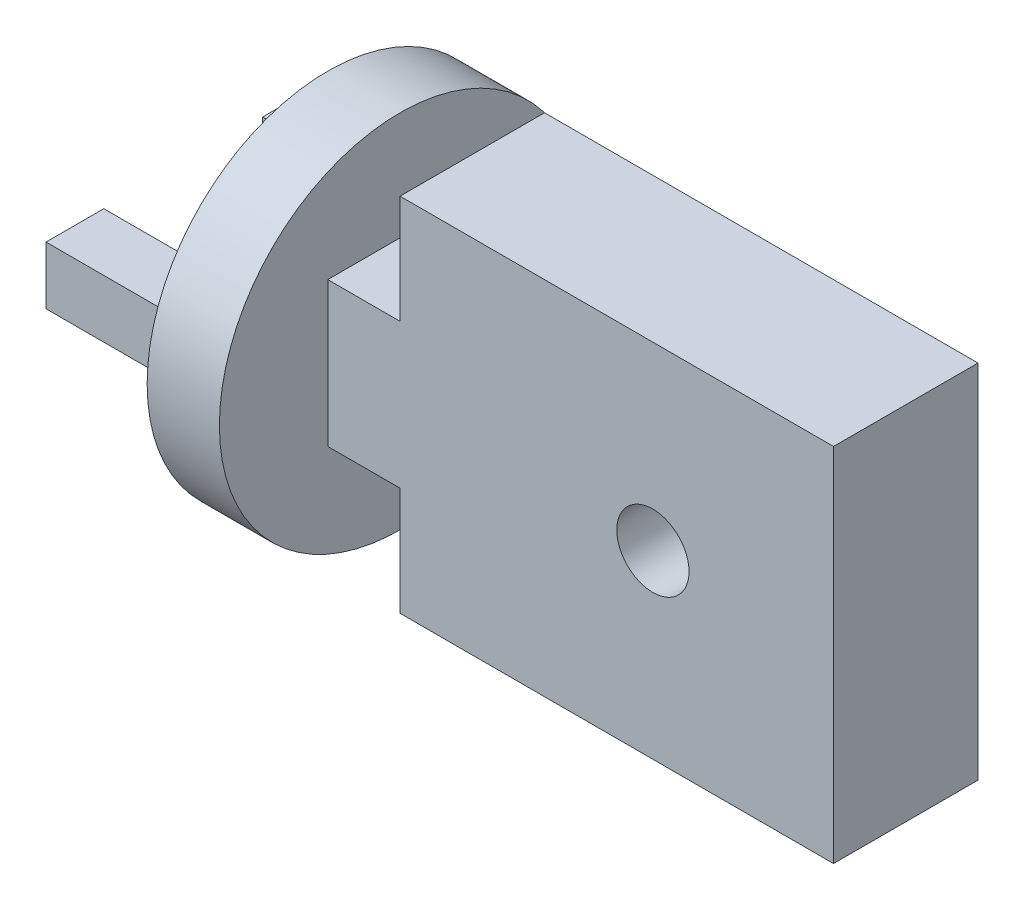
ISO-10303-21;
HEADER;
FILE_DESCRIPTION(('STEP AP214'),'2;1');
FILE_NAME('part.step','',(''),(''),'','','');
FILE_SCHEMA(('AUTOMOTIVE_DESIGN { 1 0 10303 214 1 1 1 1 }'));
ENDSEC;
DATA;
#1=APPLICATION_CONTEXT('core data for automotive mechanical design processes');
#2=APPLICATION_PROTOCOL_DEFINITION('international standard','automotive_design',2000,#1);
#3=PRODUCT_CONTEXT('',#1,'mechanical');
#4=PRODUCT('Part','Part','',(#3));
#5=PRODUCT_RELATED_PRODUCT_CATEGORY('part','',(#4));
#6=PRODUCT_DEFINITION_FORMATION('','',#4);
#7=PRODUCT_DEFINITION_CONTEXT('part definition',#1,'design');
#8=PRODUCT_DEFINITION('design','',#6,#7);
#9=PRODUCT_DEFINITION_SHAPE('','',#8);
#10=(LENGTH_UNIT() NAMED_UNIT(*) SI_UNIT(.MILLI.,.METRE.));
#11=(NAMED_UNIT(*) PLANE_ANGLE_UNIT() SI_UNIT($,.RADIAN.));
#12=(NAMED_UNIT(*) SI_UNIT($,.STERADIAN.) SOLID_ANGLE_UNIT());
#13=UNCERTAINTY_MEASURE_WITH_UNIT(LENGTH_MEASURE(1.E-05),#10,'distance_accuracy_value','');
#14=(GEOMETRIC_REPRESENTATION_CONTEXT(3) GLOBAL_UNCERTAINTY_ASSIGNED_CONTEXT((#13)) GLOBAL_UNIT_ASSIGNED_CONTEXT((#10,
#11,#12)) REPRESENTATION_CONTEXT('',''));
#15=CARTESIAN_POINT('',(0.,0.,0.));
#16=DIRECTION('',(0.,0.,1.));
#17=DIRECTION('',(1.,0.,0.));
#18=AXIS2_PLACEMENT_3D('',#15,#16,#17);
#19=CARTESIAN_POINT('',(-76.2,63.5,127.));
#20=DIRECTION('',(1.,0.,0.));
#21=DIRECTION('',(0.,1.,0.));
#22=AXIS2_PLACEMENT_3D('',#19,#20,#21);
#23=PLANE('',#22);
#24=DIRECTION('',(0.,0.,-1.));
#25=VECTOR('',#24,1.);
#26=CARTESIAN_POINT('',(-76.2,-63.5,127.));
#27=LINE('',#26,#25);
#28=CARTESIAN_POINT('',(-76.2,-63.5,88.9));
#29=VERTEX_POINT('',#28);
#30=CARTESIAN_POINT('',(-76.2,-63.5,38.1));
#31=VERTEX_POINT('',#30);
#32=EDGE_CURVE('E181',#29,#31,#27,.T.);
#33=ORIENTED_EDGE('',*,*,#32,.F.);
#34=DIRECTION('',(0.,1.,0.));
#35=VECTOR('',#34,1.);
#36=CARTESIAN_POINT('',(-76.2,-63.5,88.9));
#37=LINE('',#36,#35);
#38=CARTESIAN_POINT('',(-76.2,-25.4,88.9));
#39=VERTEX_POINT('',#38);
#40=EDGE_CURVE('E161',#29,#39,#37,.T.);
#41=ORIENTED_EDGE('',*,*,#40,.T.);
#42=DIRECTION('',(0.,0.,1.));
#43=VECTOR('',#42,1.);
#44=CARTESIAN_POINT('',(-76.2,-25.4,38.1));
#45=LINE('',#44,#43);
#46=CARTESIAN_POINT('',(-76.2,-25.4,38.1));
#47=VERTEX_POINT('',#46);
#48=EDGE_CURVE('E312',#47,#39,#45,.T.);
#49=ORIENTED_EDGE('',*,*,#48,.F.);
#50=DIRECTION('',(0.,1.,0.));
#51=VECTOR('',#50,1.);
#52=CARTESIAN_POINT('',(-76.2,-63.5,38.1));
#53=LINE('',#52,#51);
#54=EDGE_CURVE('E217',#31,#47,#53,.T.);
#55=ORIENTED_EDGE('',*,*,#54,.F.);
#56=EDGE_LOOP('',(#33,#41,#49,#55));
#57=FACE_BOUND('',#56,.T.);
#58=ADVANCED_FACE('F39',(#57),#23,.F.);
#59=CARTESIAN_POINT('',(-127.,0.,63.5));
#60=DIRECTION('',(-1.,0.,0.));
#61=DIRECTION('',(0.,0.,1.));
#62=AXIS2_PLACEMENT_3D('',#59,#60,#61);
#63=PLANE('',#62);
#64=CARTESIAN_POINT('',(-127.,0.,63.5));
#65=DIRECTION('',(-1.,0.,0.));
#66=DIRECTION('',(0.,0.,1.));
#67=AXIS2_PLACEMENT_3D('',#64,#65,#66);
#68=CIRCLE('',#67,63.5);
#69=CARTESIAN_POINT('',(-127.,0.,127.));
#70=VERTEX_POINT('',#69);
#71=EDGE_CURVE('E299',#70,#70,#68,.T.);
#72=ORIENTED_EDGE('',*,*,#71,.T.);
#73=EDGE_LOOP('',(#72));
#74=FACE_BOUND('',#73,.T.);
#75=DIRECTION('',(0.,0.,-1.));
#76=VECTOR('',#75,1.);
#77=CARTESIAN_POINT('',(-127.,10.16,15.24));
#78=LINE('',#77,#76);
#79=CARTESIAN_POINT('',(-127.,10.16,35.56));
#80=VERTEX_POINT('',#79);
#81=CARTESIAN_POINT('',(-127.,10.16,15.24));
#82=VERTEX_POINT('',#81);
#83=EDGE_CURVE('E278',#80,#82,#78,.T.);
#84=ORIENTED_EDGE('',*,*,#83,.F.);
#85=DIRECTION('',(0.,1.,0.));
#86=VECTOR('',#85,1.);
#87=CARTESIAN_POINT('',(-127.,10.16,35.56));
#88=LINE('',#87,#86);
#89=CARTESIAN_POINT('',(-127.,-10.16,35.56));
#90=VERTEX_POINT('',#89);
#91=EDGE_CURVE('E259',#90,#80,#88,.T.);
#92=ORIENTED_EDGE('',*,*,#91,.F.);
#93=DIRECTION('',(0.,0.,1.));
#94=VECTOR('',#93,1.);
#95=CARTESIAN_POINT('',(-127.,-10.16,15.24));
#96=LINE('',#95,#94);
#97=CARTESIAN_POINT('',(-127.,-10.16,15.24));
#98=VERTEX_POINT('',#97);
#99=EDGE_CURVE('E265',#98,#90,#96,.T.);
#100=ORIENTED_EDGE('',*,*,#99,.F.);
#101=DIRECTION('',(0.,-1.,0.));
#102=VECTOR('',#101,1.);
#103=CARTESIAN_POINT('',(-127.,10.16,15.24));
#104=LINE('',#103,#102);
#105=EDGE_CURVE('E281',#82,#98,#104,.T.);
#106=ORIENTED_EDGE('',*,*,#105,.F.);
#107=EDGE_LOOP('',(#84,#92,#100,#106));
#108=FACE_BOUND('',#107,.T.);
#109=DIRECTION('',(0.,0.,-1.));
#110=VECTOR('',#109,1.);
#111=CARTESIAN_POINT('',(-127.,10.16,91.44));
#112=LINE('',#111,#110);
#113=CARTESIAN_POINT('',(-127.,10.16,111.76));
#114=VERTEX_POINT('',#113);
#115=CARTESIAN_POINT('',(-127.,10.16,91.44));
#116=VERTEX_POINT('',#115);
#117=EDGE_CURVE('E239',#114,#116,#112,.T.);
#118=ORIENTED_EDGE('',*,*,#117,.F.);
#119=DIRECTION('',(0.,1.,0.));
#120=VECTOR('',#119,1.);
#121=CARTESIAN_POINT('',(-127.,10.16,111.76));
#122=LINE('',#121,#120);
#123=CARTESIAN_POINT('',(-127.,-10.16,111.76));
#124=VERTEX_POINT('',#123);
#125=EDGE_CURVE('E235',#124,#114,#122,.T.);
#126=ORIENTED_EDGE('',*,*,#125,.F.);
#127=DIRECTION('',(0.,0.,1.));
#128=VECTOR('',#127,1.);
#129=CARTESIAN_POINT('',(-127.,-10.16,91.44));
#130=LINE('',#129,#128);
#131=CARTESIAN_POINT('',(-127.,-10.16,91.44));
#132=VERTEX_POINT('',#131);
#133=EDGE_CURVE('E225',#132,#124,#130,.T.);
#134=ORIENTED_EDGE('',*,*,#133,.F.);
#135=DIRECTION('',(0.,-1.,0.));
#136=VECTOR('',#135,1.);
#137=CARTESIAN_POINT('',(-127.,10.16,91.44));
#138=LINE('',#137,#136);
#139=EDGE_CURVE('E242',#116,#132,#138,.T.);
#140=ORIENTED_EDGE('',*,*,#139,.F.);
#141=EDGE_LOOP('',(#118,#126,#134,#140));
#142=FACE_BOUND('',#141,.T.);
#143=ADVANCED_FACE('F373',(#74,#108,#142),#63,.T.);
#144=DIRECTION('',(0.,0.,-1.));
#145=VECTOR('',#144,1.);
#146=CARTESIAN_POINT('',(-76.2,25.4,38.1));
#147=LINE('',#146,#145);
#148=CARTESIAN_POINT('',(-76.2,25.4,88.9));
#149=VERTEX_POINT('',#148);
#150=CARTESIAN_POINT('',(-76.2,25.4,38.1));
#151=VERTEX_POINT('',#150);
#152=EDGE_CURVE('E303',#149,#151,#147,.T.);
#153=ORIENTED_EDGE('',*,*,#152,.F.);
#154=CARTESIAN_POINT('',(-76.2,63.5,88.9));
#155=VERTEX_POINT('',#154);
#156=EDGE_CURVE('E175',#149,#155,#37,.T.);
#157=ORIENTED_EDGE('',*,*,#156,.T.);
#158=DIRECTION('',(0.,0.,-1.));
#159=VECTOR('',#158,1.);
#160=CARTESIAN_POINT('',(-76.2,63.5,127.));
#161=LINE('',#160,#159);
#162=CARTESIAN_POINT('',(-76.2,63.5,38.1));
#163=VERTEX_POINT('',#162);
#164=EDGE_CURVE('E49',#155,#163,#161,.T.);
#165=ORIENTED_EDGE('',*,*,#164,.T.);
#166=EDGE_CURVE('E199',#151,#163,#53,.T.);
#167=ORIENTED_EDGE('',*,*,#166,.F.);
#168=EDGE_LOOP('',(#153,#157,#165,#167));
#169=FACE_BOUND('',#168,.T.);
#170=ADVANCED_FACE('F198',(#169),#23,.F.);
#171=CARTESIAN_POINT('',(76.2,63.5,127.));
#172=DIRECTION('',(-1.,0.,0.));
#173=DIRECTION('',(0.,-1.,0.));
#174=AXIS2_PLACEMENT_3D('',#171,#172,#173);
#175=PLANE('',#174);
#176=DIRECTION('',(0.,0.,-1.));
#177=VECTOR('',#176,1.);
#178=CARTESIAN_POINT('',(76.2,63.5,127.));
#179=LINE('',#178,#177);
#180=CARTESIAN_POINT('',(76.2,63.5,88.9));
#181=VERTEX_POINT('',#180);
#182=CARTESIAN_POINT('',(76.2,63.5,38.1));
#183=VERTEX_POINT('',#182);
#184=EDGE_CURVE('E11',#181,#183,#179,.T.);
#185=ORIENTED_EDGE('',*,*,#184,.F.);
#186=DIRECTION('',(0.,1.,0.));
#187=VECTOR('',#186,1.);
#188=CARTESIAN_POINT('',(76.2,-63.5,88.9));
#189=LINE('',#188,#187);
#190=CARTESIAN_POINT('',(76.2,-63.5,88.9));
#191=VERTEX_POINT('',#190);
#192=EDGE_CURVE('E159',#191,#181,#189,.T.);
#193=ORIENTED_EDGE('',*,*,#192,.F.);
#194=DIRECTION('',(0.,0.,-1.));
#195=VECTOR('',#194,1.);
#196=CARTESIAN_POINT('',(76.2,-63.5,127.));
#197=LINE('',#196,#195);
#198=CARTESIAN_POINT('',(76.2,-63.5,38.1));
#199=VERTEX_POINT('',#198);
#200=EDGE_CURVE('E173',#191,#199,#197,.T.);
#201=ORIENTED_EDGE('',*,*,#200,.T.);
#202=DIRECTION('',(0.,1.,0.));
#203=VECTOR('',#202,1.);
#204=CARTESIAN_POINT('',(76.2,-63.5,38.1));
#205=LINE('',#204,#203);
#206=EDGE_CURVE('E214',#199,#183,#205,.T.);
#207=ORIENTED_EDGE('',*,*,#206,.T.);
#208=EDGE_LOOP('',(#185,#193,#201,#207));
#209=FACE_BOUND('',#208,.T.);
#210=ADVANCED_FACE('F41',(#209),#175,.F.);
#211=CARTESIAN_POINT('',(-76.2,63.5,127.));
#212=DIRECTION('',(0.,-1.,0.));
#213=DIRECTION('',(0.,0.,-1.));
#214=AXIS2_PLACEMENT_3D('',#211,#212,#213);
#215=PLANE('',#214);
#216=ORIENTED_EDGE('',*,*,#164,.F.);
#217=DIRECTION('',(-1.,0.,0.));
#218=VECTOR('',#217,1.);
#219=CARTESIAN_POINT('',(76.2,63.5,88.9));
#220=LINE('',#219,#218);
#221=EDGE_CURVE('E167',#181,#155,#220,.T.);
#222=ORIENTED_EDGE('',*,*,#221,.F.);
#223=ORIENTED_EDGE('',*,*,#184,.T.);
#224=DIRECTION('',(1.,0.,0.));
#225=VECTOR('',#224,1.);
#226=CARTESIAN_POINT('',(76.2,63.5,38.1));
#227=LINE('',#226,#225);
#228=EDGE_CURVE('E204',#163,#183,#227,.T.);
#229=ORIENTED_EDGE('',*,*,#228,.F.);
#230=EDGE_LOOP('',(#216,#222,#223,#229));
#231=FACE_BOUND('',#230,.T.);
#232=ADVANCED_FACE('F203',(#231),#215,.F.);
#233=CARTESIAN_POINT('',(-76.2,-63.5,127.));
#234=DIRECTION('',(0.,1.,0.));
#235=DIRECTION('',(0.,0.,1.));
#236=AXIS2_PLACEMENT_3D('',#233,#234,#235);
#237=PLANE('',#236);
#238=ORIENTED_EDGE('',*,*,#200,.F.);
#239=DIRECTION('',(-1.,0.,0.));
#240=VECTOR('',#239,1.);
#241=CARTESIAN_POINT('',(76.2,-63.5,88.9));
#242=LINE('',#241,#240);
#243=EDGE_CURVE('E155',#191,#29,#242,.T.);
#244=ORIENTED_EDGE('',*,*,#243,.T.);
#245=ORIENTED_EDGE('',*,*,#32,.T.);
#246=DIRECTION('',(1.,0.,0.));
#247=VECTOR('',#246,1.);
#248=CARTESIAN_POINT('',(76.2,-63.5,38.1));
#249=LINE('',#248,#247);
#250=EDGE_CURVE('E179',#31,#199,#249,.T.);
#251=ORIENTED_EDGE('',*,*,#250,.T.);
#252=EDGE_LOOP('',(#238,#244,#245,#251));
#253=FACE_BOUND('',#252,.T.);
#254=ADVANCED_FACE('F178',(#253),#237,.F.);
#255=CARTESIAN_POINT('',(-101.6,25.4,88.9));
#256=DIRECTION('',(0.,0.,-1.));
#257=DIRECTION('',(0.,1.,0.));
#258=AXIS2_PLACEMENT_3D('',#255,#256,#257);
#259=PLANE('',#258);
#260=CARTESIAN_POINT('',(12.7,0.,88.9));
#261=DIRECTION('',(0.,0.,1.));
#262=DIRECTION('',(1.,0.,0.));
#263=AXIS2_PLACEMENT_3D('',#260,#261,#262);
#264=CIRCLE('',#263,12.7);
#265=CARTESIAN_POINT('',(25.4,0.,88.9));
#266=VERTEX_POINT('',#265);
#267=EDGE_CURVE('E212',#266,#266,#264,.T.);
#268=ORIENTED_EDGE('',*,*,#267,.F.);
#269=EDGE_LOOP('',(#268));
#270=FACE_BOUND('',#269,.T.);
#271=DIRECTION('',(1.,0.,0.));
#272=VECTOR('',#271,1.);
#273=CARTESIAN_POINT('',(-101.6,-25.4,88.9));
#274=LINE('',#273,#272);
#275=CARTESIAN_POINT('',(-101.6,-25.4,88.9));
#276=VERTEX_POINT('',#275);
#277=EDGE_CURVE('E324',#276,#39,#274,.T.);
#278=ORIENTED_EDGE('',*,*,#277,.T.);
#279=ORIENTED_EDGE('',*,*,#40,.F.);
#280=ORIENTED_EDGE('',*,*,#243,.F.);
#281=ORIENTED_EDGE('',*,*,#192,.T.);
#282=ORIENTED_EDGE('',*,*,#221,.T.);
#283=ORIENTED_EDGE('',*,*,#156,.F.);
#284=DIRECTION('',(1.,0.,0.));
#285=VECTOR('',#284,1.);
#286=CARTESIAN_POINT('',(-101.6,25.4,88.9));
#287=LINE('',#286,#285);
#288=CARTESIAN_POINT('',(-101.6,25.4,88.9));
#289=VERTEX_POINT('',#288);
#290=EDGE_CURVE('E182',#289,#149,#287,.T.);
#291=ORIENTED_EDGE('',*,*,#290,.F.);
#292=DIRECTION('',(0.,1.,0.));
#293=VECTOR('',#292,1.);
#294=CARTESIAN_POINT('',(-101.6,25.4,88.9));
#295=LINE('',#294,#293);
#296=EDGE_CURVE('E307',#276,#289,#295,.T.);
#297=ORIENTED_EDGE('',*,*,#296,.F.);
#298=EDGE_LOOP('',(#278,#279,#280,#281,#282,#283,#291,#297));
#299=FACE_BOUND('',#298,.T.);
#300=ADVANCED_FACE('F158',(#270,#299),#259,.F.);
#301=CARTESIAN_POINT('',(-101.6,25.4,38.1));
#302=DIRECTION('',(0.,-1.,0.));
#303=DIRECTION('',(1.,0.,0.));
#304=AXIS2_PLACEMENT_3D('',#301,#302,#303);
#305=PLANE('',#304);
#306=ORIENTED_EDGE('',*,*,#152,.T.);
#307=DIRECTION('',(1.,0.,0.));
#308=VECTOR('',#307,1.);
#309=CARTESIAN_POINT('',(-101.6,25.4,38.1));
#310=LINE('',#309,#308);
#311=CARTESIAN_POINT('',(-101.6,25.4,38.1));
#312=VERTEX_POINT('',#311);
#313=EDGE_CURVE('E188',#312,#151,#310,.T.);
#314=ORIENTED_EDGE('',*,*,#313,.F.);
#315=DIRECTION('',(0.,0.,-1.));
#316=VECTOR('',#315,1.);
#317=CARTESIAN_POINT('',(-101.6,25.4,38.1));
#318=LINE('',#317,#316);
#319=EDGE_CURVE('E311',#289,#312,#318,.T.);
#320=ORIENTED_EDGE('',*,*,#319,.F.);
#321=ORIENTED_EDGE('',*,*,#290,.T.);
#322=EDGE_LOOP('',(#306,#314,#320,#321));
#323=FACE_BOUND('',#322,.T.);
#324=ADVANCED_FACE('F340',(#323),#305,.F.);
#325=CARTESIAN_POINT('',(-101.6,25.4,38.1));
#326=DIRECTION('',(0.,0.,1.));
#327=DIRECTION('',(0.,-1.,0.));
#328=AXIS2_PLACEMENT_3D('',#325,#326,#327);
#329=PLANE('',#328);
#330=CARTESIAN_POINT('',(12.7,0.,38.1));
#331=DIRECTION('',(0.,0.,1.));
#332=DIRECTION('',(0.,-1.,0.));
#333=AXIS2_PLACEMENT_3D('',#330,#331,#332);
#334=CIRCLE('',#333,12.7);
#335=CARTESIAN_POINT('',(12.7,-12.7,38.1));
#336=VERTEX_POINT('',#335);
#337=EDGE_CURVE('E43',#336,#336,#334,.T.);
#338=ORIENTED_EDGE('',*,*,#337,.T.);
#339=EDGE_LOOP('',(#338));
#340=FACE_BOUND('',#339,.T.);
#341=ORIENTED_EDGE('',*,*,#313,.T.);
#342=ORIENTED_EDGE('',*,*,#166,.T.);
#343=ORIENTED_EDGE('',*,*,#228,.T.);
#344=ORIENTED_EDGE('',*,*,#206,.F.);
#345=ORIENTED_EDGE('',*,*,#250,.F.);
#346=ORIENTED_EDGE('',*,*,#54,.T.);
#347=DIRECTION('',(1.,0.,0.));
#348=VECTOR('',#347,1.);
#349=CARTESIAN_POINT('',(-101.6,-25.4,38.1));
#350=LINE('',#349,#348);
#351=CARTESIAN_POINT('',(-101.6,-25.4,38.1));
#352=VERTEX_POINT('',#351);
#353=EDGE_CURVE('E332',#352,#47,#350,.T.);
#354=ORIENTED_EDGE('',*,*,#353,.F.);
#355=DIRECTION('',(0.,-1.,0.));
#356=VECTOR('',#355,1.);
#357=CARTESIAN_POINT('',(-101.6,25.4,38.1));
#358=LINE('',#357,#356);
#359=EDGE_CURVE('E316',#312,#352,#358,.T.);
#360=ORIENTED_EDGE('',*,*,#359,.F.);
#361=EDGE_LOOP('',(#341,#342,#343,#344,#345,#346,#354,#360));
#362=FACE_BOUND('',#361,.T.);
#363=ADVANCED_FACE('F338',(#340,#362),#329,.F.);
#364=CARTESIAN_POINT('',(-101.6,-25.4,38.1));
#365=DIRECTION('',(0.,1.,0.));
#366=DIRECTION('',(-1.,0.,0.));
#367=AXIS2_PLACEMENT_3D('',#364,#365,#366);
#368=PLANE('',#367);
#369=ORIENTED_EDGE('',*,*,#48,.T.);
#370=ORIENTED_EDGE('',*,*,#277,.F.);
#371=DIRECTION('',(0.,0.,1.));
#372=VECTOR('',#371,1.);
#373=CARTESIAN_POINT('',(-101.6,-25.4,38.1));
#374=LINE('',#373,#372);
#375=EDGE_CURVE('E320',#352,#276,#374,.T.);
#376=ORIENTED_EDGE('',*,*,#375,.F.);
#377=ORIENTED_EDGE('',*,*,#353,.T.);
#378=EDGE_LOOP('',(#369,#370,#376,#377));
#379=FACE_BOUND('',#378,.T.);
#380=ADVANCED_FACE('F347',(#379),#368,.F.);
#381=CARTESIAN_POINT('',(-101.6,0.,63.5));
#382=DIRECTION('',(-1.,0.,0.));
#383=DIRECTION('',(0.,0.,1.));
#384=AXIS2_PLACEMENT_3D('',#381,#382,#383);
#385=PLANE('',#384);
#386=CARTESIAN_POINT('',(-101.6,0.,63.5));
#387=DIRECTION('',(-1.,0.,0.));
#388=DIRECTION('',(0.,0.,1.));
#389=AXIS2_PLACEMENT_3D('',#386,#387,#388);
#390=CIRCLE('',#389,63.5);
#391=CARTESIAN_POINT('',(-101.6,0.,127.));
#392=VERTEX_POINT('',#391);
#393=EDGE_CURVE('E298',#392,#392,#390,.T.);
#394=ORIENTED_EDGE('',*,*,#393,.F.);
#395=EDGE_LOOP('',(#394));
#396=FACE_BOUND('',#395,.T.);
#397=ORIENTED_EDGE('',*,*,#375,.T.);
#398=ORIENTED_EDGE('',*,*,#296,.T.);
#399=ORIENTED_EDGE('',*,*,#319,.T.);
#400=ORIENTED_EDGE('',*,*,#359,.T.);
#401=EDGE_LOOP('',(#397,#398,#399,#400));
#402=FACE_BOUND('',#401,.T.);
#403=ADVANCED_FACE('F344',(#396,#402),#385,.F.);
#404=CARTESIAN_POINT('',(-127.,0.,63.5));
#405=DIRECTION('',(1.,0.,0.));
#406=DIRECTION('',(0.,0.,-1.));
#407=AXIS2_PLACEMENT_3D('',#404,#405,#406);
#408=CYLINDRICAL_SURFACE('',#407,63.5);
#409=ORIENTED_EDGE('',*,*,#71,.F.);
#410=EDGE_LOOP('',(#409));
#411=FACE_BOUND('',#410,.T.);
#412=ORIENTED_EDGE('',*,*,#393,.T.);
#413=EDGE_LOOP('',(#412));
#414=FACE_BOUND('',#413,.T.);
#415=ADVANCED_FACE('F513',(#411,#414),#408,.T.);
#416=CARTESIAN_POINT('',(-177.8,10.16,35.56));
#417=DIRECTION('',(0.,0.,-1.));
#418=DIRECTION('',(-1.,0.,0.));
#419=AXIS2_PLACEMENT_3D('',#416,#417,#418);
#420=PLANE('',#419);
#421=ORIENTED_EDGE('',*,*,#91,.T.);
#422=DIRECTION('',(1.,0.,0.));
#423=VECTOR('',#422,1.);
#424=CARTESIAN_POINT('',(-177.8,10.16,35.56));
#425=LINE('',#424,#423);
#426=CARTESIAN_POINT('',(-177.8,10.16,35.56));
#427=VERTEX_POINT('',#426);
#428=EDGE_CURVE('E295',#427,#80,#425,.T.);
#429=ORIENTED_EDGE('',*,*,#428,.F.);
#430=DIRECTION('',(0.,1.,0.));
#431=VECTOR('',#430,1.);
#432=CARTESIAN_POINT('',(-177.8,10.16,35.56));
#433=LINE('',#432,#431);
#434=CARTESIAN_POINT('',(-177.8,-10.16,35.56));
#435=VERTEX_POINT('',#434);
#436=EDGE_CURVE('E260',#435,#427,#433,.T.);
#437=ORIENTED_EDGE('',*,*,#436,.F.);
#438=DIRECTION('',(1.,0.,0.));
#439=VECTOR('',#438,1.);
#440=CARTESIAN_POINT('',(-177.8,-10.16,35.56));
#441=LINE('',#440,#439);
#442=EDGE_CURVE('E274',#435,#90,#441,.T.);
#443=ORIENTED_EDGE('',*,*,#442,.T.);
#444=EDGE_LOOP('',(#421,#429,#437,#443));
#445=FACE_BOUND('',#444,.T.);
#446=ADVANCED_FACE('F505',(#445),#420,.F.);
#447=CARTESIAN_POINT('',(-177.8,10.16,15.24));
#448=DIRECTION('',(0.,-1.,0.));
#449=DIRECTION('',(0.,0.,-1.));
#450=AXIS2_PLACEMENT_3D('',#447,#448,#449);
#451=PLANE('',#450);
#452=ORIENTED_EDGE('',*,*,#83,.T.);
#453=DIRECTION('',(1.,0.,0.));
#454=VECTOR('',#453,1.);
#455=CARTESIAN_POINT('',(-177.8,10.16,15.24));
#456=LINE('',#455,#454);
#457=CARTESIAN_POINT('',(-177.8,10.16,15.24));
#458=VERTEX_POINT('',#457);
#459=EDGE_CURVE('E291',#458,#82,#456,.T.);
#460=ORIENTED_EDGE('',*,*,#459,.F.);
#461=DIRECTION('',(0.,0.,-1.));
#462=VECTOR('',#461,1.);
#463=CARTESIAN_POINT('',(-177.8,10.16,15.24));
#464=LINE('',#463,#462);
#465=EDGE_CURVE('E264',#427,#458,#464,.T.);
#466=ORIENTED_EDGE('',*,*,#465,.F.);
#467=ORIENTED_EDGE('',*,*,#428,.T.);
#468=EDGE_LOOP('',(#452,#460,#466,#467));
#469=FACE_BOUND('',#468,.T.);
#470=ADVANCED_FACE('F497',(#469),#451,.F.);
#471=CARTESIAN_POINT('',(-177.8,10.16,15.24));
#472=DIRECTION('',(0.,0.,1.));
#473=DIRECTION('',(0.,-1.,0.));
#474=AXIS2_PLACEMENT_3D('',#471,#472,#473);
#475=PLANE('',#474);
#476=ORIENTED_EDGE('',*,*,#105,.T.);
#477=DIRECTION('',(1.,0.,0.));
#478=VECTOR('',#477,1.);
#479=CARTESIAN_POINT('',(-177.8,-10.16,15.24));
#480=LINE('',#479,#478);
#481=CARTESIAN_POINT('',(-177.8,-10.16,15.24));
#482=VERTEX_POINT('',#481);
#483=EDGE_CURVE('E64',#482,#98,#480,.T.);
#484=ORIENTED_EDGE('',*,*,#483,.F.);
#485=DIRECTION('',(0.,-1.,0.));
#486=VECTOR('',#485,1.);
#487=CARTESIAN_POINT('',(-177.8,10.16,15.24));
#488=LINE('',#487,#486);
#489=EDGE_CURVE('E268',#458,#482,#488,.T.);
#490=ORIENTED_EDGE('',*,*,#489,.F.);
#491=ORIENTED_EDGE('',*,*,#459,.T.);
#492=EDGE_LOOP('',(#476,#484,#490,#491));
#493=FACE_BOUND('',#492,.T.);
#494=ADVANCED_FACE('F490',(#493),#475,.F.);
#495=CARTESIAN_POINT('',(-177.8,-10.16,15.24));
#496=DIRECTION('',(0.,1.,0.));
#497=DIRECTION('',(0.,0.,1.));
#498=AXIS2_PLACEMENT_3D('',#495,#496,#497);
#499=PLANE('',#498);
#500=ORIENTED_EDGE('',*,*,#99,.T.);
#501=ORIENTED_EDGE('',*,*,#442,.F.);
#502=DIRECTION('',(0.,0.,1.));
#503=VECTOR('',#502,1.);
#504=CARTESIAN_POINT('',(-177.8,-10.16,15.24));
#505=LINE('',#504,#503);
#506=EDGE_CURVE('E271',#482,#435,#505,.T.);
#507=ORIENTED_EDGE('',*,*,#506,.F.);
#508=ORIENTED_EDGE('',*,*,#483,.T.);
#509=EDGE_LOOP('',(#500,#501,#507,#508));
#510=FACE_BOUND('',#509,.T.);
#511=ADVANCED_FACE('F482',(#510),#499,.F.);
#512=CARTESIAN_POINT('',(-177.8,0.,0.));
#513=DIRECTION('',(-1.,0.,0.));
#514=DIRECTION('',(0.,0.,1.));
#515=AXIS2_PLACEMENT_3D('',#512,#513,#514);
#516=PLANE('',#515);
#517=ORIENTED_EDGE('',*,*,#436,.T.);
#518=ORIENTED_EDGE('',*,*,#465,.T.);
#519=ORIENTED_EDGE('',*,*,#489,.T.);
#520=ORIENTED_EDGE('',*,*,#506,.T.);
#521=EDGE_LOOP('',(#517,#518,#519,#520));
#522=FACE_BOUND('',#521,.T.);
#523=ADVANCED_FACE('F474',(#522),#516,.T.);
#524=CARTESIAN_POINT('',(-177.8,10.16,111.76));
#525=DIRECTION('',(0.,0.,-1.));
#526=DIRECTION('',(-1.,0.,0.));
#527=AXIS2_PLACEMENT_3D('',#524,#525,#526);
#528=PLANE('',#527);
#529=ORIENTED_EDGE('',*,*,#125,.T.);
#530=DIRECTION('',(1.,0.,0.));
#531=VECTOR('',#530,1.);
#532=CARTESIAN_POINT('',(-177.8,10.16,111.76));
#533=LINE('',#532,#531);
#534=CARTESIAN_POINT('',(-177.8,10.16,111.76));
#535=VERTEX_POINT('',#534);
#536=EDGE_CURVE('E256',#535,#114,#533,.T.);
#537=ORIENTED_EDGE('',*,*,#536,.F.);
#538=DIRECTION('',(0.,1.,0.));
#539=VECTOR('',#538,1.);
#540=CARTESIAN_POINT('',(-177.8,10.16,111.76));
#541=LINE('',#540,#539);
#542=CARTESIAN_POINT('',(-177.8,-10.16,111.76));
#543=VERTEX_POINT('',#542);
#544=EDGE_CURVE('E220',#543,#535,#541,.T.);
#545=ORIENTED_EDGE('',*,*,#544,.F.);
#546=DIRECTION('',(1.,0.,0.));
#547=VECTOR('',#546,1.);
#548=CARTESIAN_POINT('',(-177.8,-10.16,111.76));
#549=LINE('',#548,#547);
#550=EDGE_CURVE('E234',#543,#124,#549,.T.);
#551=ORIENTED_EDGE('',*,*,#550,.T.);
#552=EDGE_LOOP('',(#529,#537,#545,#551));
#553=FACE_BOUND('',#552,.T.);
#554=ADVANCED_FACE('F466',(#553),#528,.F.);
#555=CARTESIAN_POINT('',(-177.8,10.16,91.44));
#556=DIRECTION('',(0.,-1.,0.));
#557=DIRECTION('',(0.,0.,-1.));
#558=AXIS2_PLACEMENT_3D('',#555,#556,#557);
#559=PLANE('',#558);
#560=ORIENTED_EDGE('',*,*,#117,.T.);
#561=DIRECTION('',(1.,0.,0.));
#562=VECTOR('',#561,1.);
#563=CARTESIAN_POINT('',(-177.8,10.16,91.44));
#564=LINE('',#563,#562);
#565=CARTESIAN_POINT('',(-177.8,10.16,91.44));
#566=VERTEX_POINT('',#565);
#567=EDGE_CURVE('E252',#566,#116,#564,.T.);
#568=ORIENTED_EDGE('',*,*,#567,.F.);
#569=DIRECTION('',(0.,0.,-1.));
#570=VECTOR('',#569,1.);
#571=CARTESIAN_POINT('',(-177.8,10.16,91.44));
#572=LINE('',#571,#570);
#573=EDGE_CURVE('E224',#535,#566,#572,.T.);
#574=ORIENTED_EDGE('',*,*,#573,.F.);
#575=ORIENTED_EDGE('',*,*,#536,.T.);
#576=EDGE_LOOP('',(#560,#568,#574,#575));
#577=FACE_BOUND('',#576,.T.);
#578=ADVANCED_FACE('F458',(#577),#559,.F.);
#579=CARTESIAN_POINT('',(-177.8,10.16,91.44));
#580=DIRECTION('',(0.,0.,1.));
#581=DIRECTION('',(1.,0.,0.));
#582=AXIS2_PLACEMENT_3D('',#579,#580,#581);
#583=PLANE('',#582);
#584=ORIENTED_EDGE('',*,*,#139,.T.);
#585=DIRECTION('',(1.,0.,0.));
#586=VECTOR('',#585,1.);
#587=CARTESIAN_POINT('',(-177.8,-10.16,91.44));
#588=LINE('',#587,#586);
#589=CARTESIAN_POINT('',(-177.8,-10.16,91.44));
#590=VERTEX_POINT('',#589);
#591=EDGE_CURVE('E56',#590,#132,#588,.T.);
#592=ORIENTED_EDGE('',*,*,#591,.F.);
#593=DIRECTION('',(0.,-1.,0.));
#594=VECTOR('',#593,1.);
#595=CARTESIAN_POINT('',(-177.8,10.16,91.44));
#596=LINE('',#595,#594);
#597=EDGE_CURVE('E228',#566,#590,#596,.T.);
#598=ORIENTED_EDGE('',*,*,#597,.F.);
#599=ORIENTED_EDGE('',*,*,#567,.T.);
#600=EDGE_LOOP('',(#584,#592,#598,#599));
#601=FACE_BOUND('',#600,.T.);
#602=ADVANCED_FACE('F451',(#601),#583,.F.);
#603=CARTESIAN_POINT('',(-177.8,-10.16,91.44));
#604=DIRECTION('',(0.,1.,0.));
#605=DIRECTION('',(0.,0.,1.));
#606=AXIS2_PLACEMENT_3D('',#603,#604,#605);
#607=PLANE('',#606);
#608=ORIENTED_EDGE('',*,*,#133,.T.);
#609=ORIENTED_EDGE('',*,*,#550,.F.);
#610=DIRECTION('',(0.,0.,1.));
#611=VECTOR('',#610,1.);
#612=CARTESIAN_POINT('',(-177.8,-10.16,91.44));
#613=LINE('',#612,#611);
#614=EDGE_CURVE('E231',#590,#543,#613,.T.);
#615=ORIENTED_EDGE('',*,*,#614,.F.);
#616=ORIENTED_EDGE('',*,*,#591,.T.);
#617=EDGE_LOOP('',(#608,#609,#615,#616));
#618=FACE_BOUND('',#617,.T.);
#619=ADVANCED_FACE('F443',(#618),#607,.F.);
#620=CARTESIAN_POINT('',(-177.8,0.,0.));
#621=DIRECTION('',(-1.,0.,0.));
#622=DIRECTION('',(0.,0.,1.));
#623=AXIS2_PLACEMENT_3D('',#620,#621,#622);
#624=PLANE('',#623);
#625=ORIENTED_EDGE('',*,*,#544,.T.);
#626=ORIENTED_EDGE('',*,*,#573,.T.);
#627=ORIENTED_EDGE('',*,*,#597,.T.);
#628=ORIENTED_EDGE('',*,*,#614,.T.);
#629=EDGE_LOOP('',(#625,#626,#627,#628));
#630=FACE_BOUND('',#629,.T.);
#631=ADVANCED_FACE('F434',(#630),#624,.T.);
#632=CARTESIAN_POINT('',(12.7,0.,0.));
#633=DIRECTION('',(0.,0.,1.));
#634=DIRECTION('',(1.,0.,0.));
#635=AXIS2_PLACEMENT_3D('',#632,#633,#634);
#636=CYLINDRICAL_SURFACE('',#635,12.7);
#637=ORIENTED_EDGE('',*,*,#267,.T.);
#638=EDGE_LOOP('',(#637));
#639=FACE_BOUND('',#638,.T.);
#640=ORIENTED_EDGE('',*,*,#337,.F.);
#641=EDGE_LOOP('',(#640));
#642=FACE_BOUND('',#641,.T.);
#643=ADVANCED_FACE('F361',(#639,#642),#636,.F.);
#644=CLOSED_SHELL('',(#58,#143,#170,#210,#232,#254,#300,#324,#363,#380,#403,#415,#446,#470,#494,
#511,#523,#554,#578,#602,#619,#631,#643));
#645=MANIFOLD_SOLID_BREP('B2',#644);
#646=ADVANCED_BREP_SHAPE_REPRESENTATION('',(#18,#645),#14);
#647=SHAPE_DEFINITION_REPRESENTATION(#9,#646);
ENDSEC;
END-ISO-10303-21;
